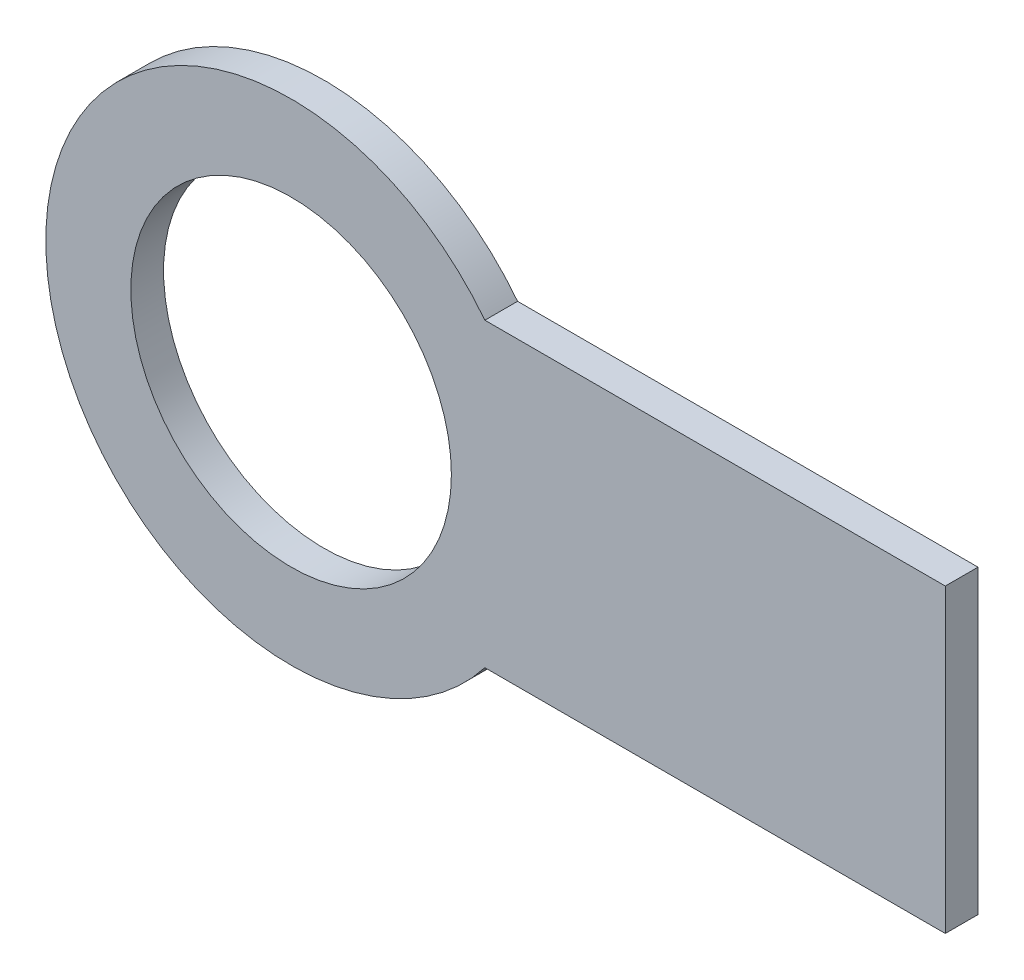
ISO-10303-21;
HEADER;
FILE_DESCRIPTION(('STEP AP214'),'2;1');
FILE_NAME('part.step','',(''),(''),'','','');
FILE_SCHEMA(('AUTOMOTIVE_DESIGN { 1 0 10303 214 1 1 1 1 }'));
ENDSEC;
DATA;
#1=APPLICATION_CONTEXT('core data for automotive mechanical design processes');
#2=APPLICATION_PROTOCOL_DEFINITION('international standard','automotive_design',2000,#1);
#3=PRODUCT_CONTEXT('',#1,'mechanical');
#4=PRODUCT('Part','Part','',(#3));
#5=PRODUCT_RELATED_PRODUCT_CATEGORY('part','',(#4));
#6=PRODUCT_DEFINITION_FORMATION('','',#4);
#7=PRODUCT_DEFINITION_CONTEXT('part definition',#1,'design');
#8=PRODUCT_DEFINITION('design','',#6,#7);
#9=PRODUCT_DEFINITION_SHAPE('','',#8);
#10=(LENGTH_UNIT() NAMED_UNIT(*) SI_UNIT(.MILLI.,.METRE.));
#11=(NAMED_UNIT(*) PLANE_ANGLE_UNIT() SI_UNIT($,.RADIAN.));
#12=(NAMED_UNIT(*) SI_UNIT($,.STERADIAN.) SOLID_ANGLE_UNIT());
#13=UNCERTAINTY_MEASURE_WITH_UNIT(LENGTH_MEASURE(1.E-05),#10,'distance_accuracy_value','');
#14=(GEOMETRIC_REPRESENTATION_CONTEXT(3) GLOBAL_UNCERTAINTY_ASSIGNED_CONTEXT((#13)) GLOBAL_UNIT_ASSIGNED_CONTEXT((#10,
#11,#12)) REPRESENTATION_CONTEXT('',''));
#15=CARTESIAN_POINT('',(0.,0.,0.));
#16=DIRECTION('',(0.,0.,1.));
#17=DIRECTION('',(1.,0.,0.));
#18=AXIS2_PLACEMENT_3D('',#15,#16,#17);
#19=CARTESIAN_POINT('',(0.,0.,-0.5));
#20=DIRECTION('',(0.,0.,1.));
#21=DIRECTION('',(1.,0.,0.));
#22=AXIS2_PLACEMENT_3D('',#19,#20,#21);
#23=CYLINDRICAL_SURFACE('',#22,3.75);
#24=CARTESIAN_POINT('',(0.,0.,0.));
#25=DIRECTION('',(0.,0.,1.));
#26=DIRECTION('',(1.,0.,0.));
#27=AXIS2_PLACEMENT_3D('',#24,#25,#26);
#28=CIRCLE('',#27,3.75);
#29=CARTESIAN_POINT('',(2.96184064392399,2.30000000000002,0.));
#30=VERTEX_POINT('',#29);
#31=CARTESIAN_POINT('',(2.96184064392399,-2.29999999999998,0.));
#32=VERTEX_POINT('',#31);
#33=EDGE_CURVE('E121',#30,#32,#28,.T.);
#34=ORIENTED_EDGE('',*,*,#33,.F.);
#35=DIRECTION('',(0.,0.,1.));
#36=VECTOR('',#35,1.);
#37=CARTESIAN_POINT('',(2.96184064392399,2.30000000000002,-0.5));
#38=LINE('',#37,#36);
#39=CARTESIAN_POINT('',(2.96184064392399,2.30000000000002,-0.5));
#40=VERTEX_POINT('',#39);
#41=EDGE_CURVE('E11',#40,#30,#38,.T.);
#42=ORIENTED_EDGE('',*,*,#41,.F.);
#43=CARTESIAN_POINT('',(0.,0.,-0.5));
#44=DIRECTION('',(0.,0.,1.));
#45=DIRECTION('',(1.,0.,0.));
#46=AXIS2_PLACEMENT_3D('',#43,#44,#45);
#47=CIRCLE('',#46,3.75);
#48=CARTESIAN_POINT('',(2.96184064392399,-2.29999999999998,-0.5));
#49=VERTEX_POINT('',#48);
#50=EDGE_CURVE('E110',#40,#49,#47,.T.);
#51=ORIENTED_EDGE('',*,*,#50,.T.);
#52=DIRECTION('',(0.,0.,1.));
#53=VECTOR('',#52,1.);
#54=CARTESIAN_POINT('',(2.96184064392399,-2.29999999999998,-0.5));
#55=LINE('',#54,#53);
#56=EDGE_CURVE('E45',#49,#32,#55,.T.);
#57=ORIENTED_EDGE('',*,*,#56,.T.);
#58=EDGE_LOOP('',(#34,#42,#51,#57));
#59=FACE_BOUND('',#58,.T.);
#60=ADVANCED_FACE('F42',(#59),#23,.T.);
#61=CARTESIAN_POINT('',(2.96184064392399,2.30000000000002,-0.5));
#62=DIRECTION('',(0.,1.,0.));
#63=DIRECTION('',(-1.,0.,0.));
#64=AXIS2_PLACEMENT_3D('',#61,#62,#63);
#65=PLANE('',#64);
#66=DIRECTION('',(-1.,0.,0.));
#67=VECTOR('',#66,1.);
#68=CARTESIAN_POINT('',(2.96184064392399,2.30000000000002,0.));
#69=LINE('',#68,#67);
#70=CARTESIAN_POINT('',(10.,2.30000000000002,0.));
#71=VERTEX_POINT('',#70);
#72=EDGE_CURVE('E115',#71,#30,#69,.T.);
#73=ORIENTED_EDGE('',*,*,#72,.F.);
#74=DIRECTION('',(0.,0.,1.));
#75=VECTOR('',#74,1.);
#76=CARTESIAN_POINT('',(10.,2.30000000000002,-0.5));
#77=LINE('',#76,#75);
#78=CARTESIAN_POINT('',(10.,2.30000000000002,-0.5));
#79=VERTEX_POINT('',#78);
#80=EDGE_CURVE('E52',#79,#71,#77,.T.);
#81=ORIENTED_EDGE('',*,*,#80,.F.);
#82=DIRECTION('',(-1.,0.,0.));
#83=VECTOR('',#82,1.);
#84=CARTESIAN_POINT('',(2.96184064392399,2.30000000000002,-0.5));
#85=LINE('',#84,#83);
#86=EDGE_CURVE('E105',#79,#40,#85,.T.);
#87=ORIENTED_EDGE('',*,*,#86,.T.);
#88=ORIENTED_EDGE('',*,*,#41,.T.);
#89=EDGE_LOOP('',(#73,#81,#87,#88));
#90=FACE_BOUND('',#89,.T.);
#91=ADVANCED_FACE('F174',(#90),#65,.T.);
#92=CARTESIAN_POINT('',(10.,2.30000000000002,-0.5));
#93=DIRECTION('',(1.,0.,0.));
#94=DIRECTION('',(0.,0.,-1.));
#95=AXIS2_PLACEMENT_3D('',#92,#93,#94);
#96=PLANE('',#95);
#97=DIRECTION('',(0.,1.,0.));
#98=VECTOR('',#97,1.);
#99=CARTESIAN_POINT('',(10.,2.30000000000002,0.));
#100=LINE('',#99,#98);
#101=CARTESIAN_POINT('',(9.99999999999998,-2.29999999999998,0.));
#102=VERTEX_POINT('',#101);
#103=EDGE_CURVE('E99',#102,#71,#100,.T.);
#104=ORIENTED_EDGE('',*,*,#103,.F.);
#105=DIRECTION('',(0.,0.,1.));
#106=VECTOR('',#105,1.);
#107=CARTESIAN_POINT('',(9.99999999999998,-2.29999999999998,-0.5));
#108=LINE('',#107,#106);
#109=CARTESIAN_POINT('',(9.99999999999998,-2.29999999999998,-0.5));
#110=VERTEX_POINT('',#109);
#111=EDGE_CURVE('E94',#110,#102,#108,.T.);
#112=ORIENTED_EDGE('',*,*,#111,.F.);
#113=DIRECTION('',(0.,1.,0.));
#114=VECTOR('',#113,1.);
#115=CARTESIAN_POINT('',(10.,2.30000000000002,-0.5));
#116=LINE('',#115,#114);
#117=EDGE_CURVE('E97',#110,#79,#116,.T.);
#118=ORIENTED_EDGE('',*,*,#117,.T.);
#119=ORIENTED_EDGE('',*,*,#80,.T.);
#120=EDGE_LOOP('',(#104,#112,#118,#119));
#121=FACE_BOUND('',#120,.T.);
#122=ADVANCED_FACE('F96',(#121),#96,.T.);
#123=CARTESIAN_POINT('',(2.96184064392399,-2.29999999999998,-0.5));
#124=DIRECTION('',(0.,-1.,0.));
#125=DIRECTION('',(1.,0.,0.));
#126=AXIS2_PLACEMENT_3D('',#123,#124,#125);
#127=PLANE('',#126);
#128=DIRECTION('',(1.,0.,0.));
#129=VECTOR('',#128,1.);
#130=CARTESIAN_POINT('',(2.96184064392399,-2.29999999999998,0.));
#131=LINE('',#130,#129);
#132=EDGE_CURVE('E125',#32,#102,#131,.T.);
#133=ORIENTED_EDGE('',*,*,#132,.F.);
#134=ORIENTED_EDGE('',*,*,#56,.F.);
#135=DIRECTION('',(1.,0.,0.));
#136=VECTOR('',#135,1.);
#137=CARTESIAN_POINT('',(2.96184064392399,-2.29999999999998,-0.5));
#138=LINE('',#137,#136);
#139=EDGE_CURVE('E104',#49,#110,#138,.T.);
#140=ORIENTED_EDGE('',*,*,#139,.T.);
#141=ORIENTED_EDGE('',*,*,#111,.T.);
#142=EDGE_LOOP('',(#133,#134,#140,#141));
#143=FACE_BOUND('',#142,.T.);
#144=ADVANCED_FACE('F108',(#143),#127,.T.);
#145=CARTESIAN_POINT('',(0.,0.,-0.5));
#146=DIRECTION('',(0.,0.,1.));
#147=DIRECTION('',(1.,0.,0.));
#148=AXIS2_PLACEMENT_3D('',#145,#146,#147);
#149=PLANE('',#148);
#150=CARTESIAN_POINT('',(0.,0.,-0.5));
#151=DIRECTION('',(0.,0.,1.));
#152=DIRECTION('',(1.,0.,0.));
#153=AXIS2_PLACEMENT_3D('',#150,#151,#152);
#154=CIRCLE('',#153,2.45);
#155=CARTESIAN_POINT('',(2.45,0.,-0.500000000000001));
#156=VERTEX_POINT('',#155);
#157=EDGE_CURVE('E126',#156,#156,#154,.T.);
#158=ORIENTED_EDGE('',*,*,#157,.T.);
#159=EDGE_LOOP('',(#158));
#160=FACE_BOUND('',#159,.T.);
#161=ORIENTED_EDGE('',*,*,#50,.F.);
#162=ORIENTED_EDGE('',*,*,#86,.F.);
#163=ORIENTED_EDGE('',*,*,#117,.F.);
#164=ORIENTED_EDGE('',*,*,#139,.F.);
#165=EDGE_LOOP('',(#161,#162,#163,#164));
#166=FACE_BOUND('',#165,.T.);
#167=ADVANCED_FACE('F103',(#160,#166),#149,.F.);
#168=CARTESIAN_POINT('',(0.,0.,0.));
#169=DIRECTION('',(0.,0.,1.));
#170=DIRECTION('',(1.,0.,0.));
#171=AXIS2_PLACEMENT_3D('',#168,#169,#170);
#172=PLANE('',#171);
#173=CARTESIAN_POINT('',(0.,0.,0.));
#174=DIRECTION('',(0.,0.,1.));
#175=DIRECTION('',(1.,0.,0.));
#176=AXIS2_PLACEMENT_3D('',#173,#174,#175);
#177=CIRCLE('',#176,2.45);
#178=CARTESIAN_POINT('',(2.45,0.,0.));
#179=VERTEX_POINT('',#178);
#180=EDGE_CURVE('E161',#179,#179,#177,.T.);
#181=ORIENTED_EDGE('',*,*,#180,.F.);
#182=EDGE_LOOP('',(#181));
#183=FACE_BOUND('',#182,.T.);
#184=ORIENTED_EDGE('',*,*,#33,.T.);
#185=ORIENTED_EDGE('',*,*,#132,.T.);
#186=ORIENTED_EDGE('',*,*,#103,.T.);
#187=ORIENTED_EDGE('',*,*,#72,.T.);
#188=EDGE_LOOP('',(#184,#185,#186,#187));
#189=FACE_BOUND('',#188,.T.);
#190=ADVANCED_FACE('F170',(#183,#189),#172,.T.);
#191=CARTESIAN_POINT('',(0.,0.,-0.5));
#192=DIRECTION('',(0.,0.,1.));
#193=DIRECTION('',(1.,0.,0.));
#194=AXIS2_PLACEMENT_3D('',#191,#192,#193);
#195=CYLINDRICAL_SURFACE('',#194,2.45);
#196=CARTESIAN_POINT('',(2.45,0.,-0.500000000000001));
#197=CARTESIAN_POINT('',(2.45,0.,-0.494791666666667));
#198=CARTESIAN_POINT('',(2.45,0.,-0.489583333333334));
#199=CARTESIAN_POINT('',(2.45,0.,-0.479166666666667));
#200=CARTESIAN_POINT('',(2.45,0.,-0.473958333333334));
#201=CARTESIAN_POINT('',(2.45,0.,-0.463541666666667));
#202=CARTESIAN_POINT('',(2.45,0.,-0.458333333333334));
#203=CARTESIAN_POINT('',(2.45,0.,-0.447916666666667));
#204=CARTESIAN_POINT('',(2.45,0.,-0.442708333333334));
#205=CARTESIAN_POINT('',(2.45,0.,-0.432291666666667));
#206=CARTESIAN_POINT('',(2.45,0.,-0.427083333333334));
#207=CARTESIAN_POINT('',(2.45,0.,-0.416666666666667));
#208=CARTESIAN_POINT('',(2.45,0.,-0.411458333333334));
#209=CARTESIAN_POINT('',(2.45,0.,-0.401041666666667));
#210=CARTESIAN_POINT('',(2.45,0.,-0.395833333333334));
#211=CARTESIAN_POINT('',(2.45,0.,-0.385416666666667));
#212=CARTESIAN_POINT('',(2.45,0.,-0.380208333333334));
#213=CARTESIAN_POINT('',(2.45,0.,-0.369791666666667));
#214=CARTESIAN_POINT('',(2.45,0.,-0.364583333333334));
#215=CARTESIAN_POINT('',(2.45,0.,-0.354166666666667));
#216=CARTESIAN_POINT('',(2.45,0.,-0.348958333333334));
#217=CARTESIAN_POINT('',(2.45,0.,-0.338541666666667));
#218=CARTESIAN_POINT('',(2.45,0.,-0.333333333333334));
#219=CARTESIAN_POINT('',(2.45,0.,-0.322916666666667));
#220=CARTESIAN_POINT('',(2.45,0.,-0.317708333333334));
#221=CARTESIAN_POINT('',(2.45,0.,-0.307291666666667));
#222=CARTESIAN_POINT('',(2.45,0.,-0.302083333333334));
#223=CARTESIAN_POINT('',(2.45,0.,-0.291666666666667));
#224=CARTESIAN_POINT('',(2.45,0.,-0.286458333333334));
#225=CARTESIAN_POINT('',(2.45,0.,-0.276041666666667));
#226=CARTESIAN_POINT('',(2.45,0.,-0.270833333333334));
#227=CARTESIAN_POINT('',(2.45,0.,-0.260416666666667));
#228=CARTESIAN_POINT('',(2.45,0.,-0.255208333333334));
#229=CARTESIAN_POINT('',(2.45,0.,-0.244791666666667));
#230=CARTESIAN_POINT('',(2.45,0.,-0.239583333333334));
#231=CARTESIAN_POINT('',(2.45,0.,-0.229166666666667));
#232=CARTESIAN_POINT('',(2.45,0.,-0.223958333333334));
#233=CARTESIAN_POINT('',(2.45,0.,-0.213541666666667));
#234=CARTESIAN_POINT('',(2.45,0.,-0.208333333333333));
#235=CARTESIAN_POINT('',(2.45,0.,-0.197916666666667));
#236=CARTESIAN_POINT('',(2.45,0.,-0.192708333333334));
#237=CARTESIAN_POINT('',(2.45,0.,-0.182291666666667));
#238=CARTESIAN_POINT('',(2.45,0.,-0.177083333333333));
#239=CARTESIAN_POINT('',(2.45,0.,-0.166666666666667));
#240=CARTESIAN_POINT('',(2.45,0.,-0.161458333333333));
#241=CARTESIAN_POINT('',(2.45,0.,-0.151041666666667));
#242=CARTESIAN_POINT('',(2.45,0.,-0.145833333333333));
#243=CARTESIAN_POINT('',(2.45,0.,-0.135416666666667));
#244=CARTESIAN_POINT('',(2.45,0.,-0.130208333333333));
#245=CARTESIAN_POINT('',(2.45,0.,-0.119791666666667));
#246=CARTESIAN_POINT('',(2.45,0.,-0.114583333333333));
#247=CARTESIAN_POINT('',(2.45,0.,-0.104166666666667));
#248=CARTESIAN_POINT('',(2.45,0.,-0.0989583333333334));
#249=CARTESIAN_POINT('',(2.45,0.,-0.0885416666666667));
#250=CARTESIAN_POINT('',(2.45,0.,-0.0833333333333334));
#251=CARTESIAN_POINT('',(2.45,0.,-0.0729166666666667));
#252=CARTESIAN_POINT('',(2.45,0.,-0.0677083333333334));
#253=CARTESIAN_POINT('',(2.45,0.,-0.0572916666666667));
#254=CARTESIAN_POINT('',(2.45,0.,-0.0520833333333334));
#255=CARTESIAN_POINT('',(2.45,0.,-0.0416666666666667));
#256=CARTESIAN_POINT('',(2.45,0.,-0.0364583333333333));
#257=CARTESIAN_POINT('',(2.45,0.,-0.0260416666666666));
#258=CARTESIAN_POINT('',(2.45,0.,-0.0208333333333333));
#259=CARTESIAN_POINT('',(2.45,0.,-0.0104166666666666));
#260=CARTESIAN_POINT('',(2.45,0.,-0.00520833333333332));
#261=CARTESIAN_POINT('',(2.45,0.,0.));
#262=B_SPLINE_CURVE_WITH_KNOTS('',3,(#196,#197,#198,#199,#200,#201,#202,#203,#204,#205,#206,
#207,#208,#209,#210,#211,#212,#213,#214,#215,#216,#217,#218,#219,#220,#221,#222,#223,#224,#225,
#226,#227,#228,#229,#230,#231,#232,#233,#234,#235,#236,#237,#238,#239,#240,#241,#242,#243,#244,
#245,#246,#247,#248,#249,#250,#251,#252,#253,#254,#255,#256,#257,#258,#259,#260,#261),
.UNSPECIFIED.,.F.,.F.,(4,2,2,2,2,2,2,2,2,2,2,2,2,2,2,2,2,2,2,2,2,2,2,2,2,2,2,2,2,2,2,2,4),(0.,
0.0156250000000001,0.0312500000000001,0.0468750000000001,0.0625000000000001,0.0781250000000001,
0.0937500000000001,0.109375,0.125,0.140625,0.15625,0.171875,0.1875,0.203125,0.21875,0.234375,
0.25,0.265625,0.28125,0.296875,0.3125,0.328125,0.34375,0.359375,0.375,0.390625,0.40625,
0.421875000000001,0.4375,0.453125,0.468750000000001,0.484375000000001,0.500000000000001),.UNSPECIFIED.);
#263=EDGE_CURVE('BSEAM168',#156,#179,#262,.T.);
#264=ORIENTED_EDGE('',*,*,#157,.F.);
#265=ORIENTED_EDGE('',*,*,#180,.T.);
#266=ORIENTED_EDGE('',*,*,#263,.T.);
#267=ORIENTED_EDGE('',*,*,#263,.F.);
#268=EDGE_LOOP('',(#264,#266,#265,#267));
#269=FACE_BOUND('',#268,.T.);
#270=ADVANCED_FACE('F168',(#269),#195,.F.);
#271=CLOSED_SHELL('',(#60,#91,#122,#144,#167,#190,#270));
#272=MANIFOLD_SOLID_BREP('B2',#271);
#273=ADVANCED_BREP_SHAPE_REPRESENTATION('',(#18,#272),#14);
#274=SHAPE_DEFINITION_REPRESENTATION(#9,#273);
ENDSEC;
END-ISO-10303-21;
